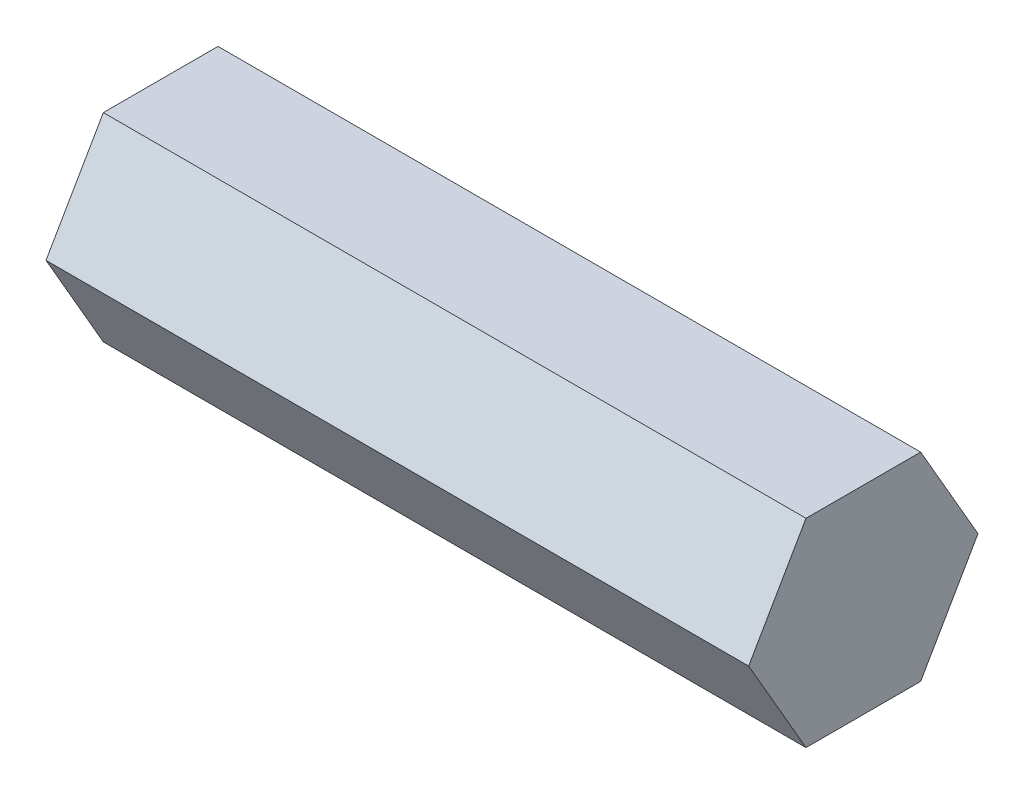
ISO-10303-21;
HEADER;
FILE_DESCRIPTION(('STEP AP214'),'2;1');
FILE_NAME('part.step','',(''),(''),'','','');
FILE_SCHEMA(('AUTOMOTIVE_DESIGN { 1 0 10303 214 1 1 1 1 }'));
ENDSEC;
DATA;
#1=APPLICATION_CONTEXT('core data for automotive mechanical design processes');
#2=APPLICATION_PROTOCOL_DEFINITION('international standard','automotive_design',2000,#1);
#3=PRODUCT_CONTEXT('',#1,'mechanical');
#4=PRODUCT('Part','Part','',(#3));
#5=PRODUCT_RELATED_PRODUCT_CATEGORY('part','',(#4));
#6=PRODUCT_DEFINITION_FORMATION('','',#4);
#7=PRODUCT_DEFINITION_CONTEXT('part definition',#1,'design');
#8=PRODUCT_DEFINITION('design','',#6,#7);
#9=PRODUCT_DEFINITION_SHAPE('','',#8);
#10=(LENGTH_UNIT() NAMED_UNIT(*) SI_UNIT(.MILLI.,.METRE.));
#11=(NAMED_UNIT(*) PLANE_ANGLE_UNIT() SI_UNIT($,.RADIAN.));
#12=(NAMED_UNIT(*) SI_UNIT($,.STERADIAN.) SOLID_ANGLE_UNIT());
#13=UNCERTAINTY_MEASURE_WITH_UNIT(LENGTH_MEASURE(1.E-05),#10,'distance_accuracy_value','');
#14=(GEOMETRIC_REPRESENTATION_CONTEXT(3) GLOBAL_UNCERTAINTY_ASSIGNED_CONTEXT((#13)) GLOBAL_UNIT_ASSIGNED_CONTEXT((#10,
#11,#12)) REPRESENTATION_CONTEXT('',''));
#15=CARTESIAN_POINT('',(0.,0.,0.));
#16=DIRECTION('',(0.,0.,1.));
#17=DIRECTION('',(1.,0.,0.));
#18=AXIS2_PLACEMENT_3D('',#15,#16,#17);
#19=CARTESIAN_POINT('',(44.935,-6.34999999999996,-3.6661742093542));
#20=DIRECTION('',(0.,0.499999999999995,0.866025403784442));
#21=DIRECTION('',(0.,-0.866025403784442,0.499999999999995));
#22=AXIS2_PLACEMENT_3D('',#19,#20,#21);
#23=PLANE('',#22);
#24=DIRECTION('',(0.,0.866025403784441,-0.499999999999995));
#25=VECTOR('',#24,1.);
#26=CARTESIAN_POINT('',(0.,-6.34999999999996,-3.6661742093542));
#27=LINE('',#26,#25);
#28=CARTESIAN_POINT('',(0.,-6.34999999999996,-3.6661742093542));
#29=VERTEX_POINT('',#28);
#30=CARTESIAN_POINT('',(0.,0.,-7.33234841870825));
#31=VERTEX_POINT('',#30);
#32=EDGE_CURVE('E125',#29,#31,#27,.T.);
#33=ORIENTED_EDGE('',*,*,#32,.T.);
#34=DIRECTION('',(-1.,0.,0.));
#35=VECTOR('',#34,1.);
#36=CARTESIAN_POINT('',(44.935,0.,-7.33234841870825));
#37=LINE('',#36,#35);
#38=CARTESIAN_POINT('',(44.935,0.,-7.33234841870825));
#39=VERTEX_POINT('',#38);
#40=EDGE_CURVE('E11',#39,#31,#37,.T.);
#41=ORIENTED_EDGE('',*,*,#40,.F.);
#42=DIRECTION('',(0.,0.866025403784441,-0.499999999999995));
#43=VECTOR('',#42,1.);
#44=CARTESIAN_POINT('',(44.935,-6.34999999999996,-3.6661742093542));
#45=LINE('',#44,#43);
#46=CARTESIAN_POINT('',(44.935,-6.34999999999996,-3.6661742093542));
#47=VERTEX_POINT('',#46);
#48=EDGE_CURVE('E135',#47,#39,#45,.T.);
#49=ORIENTED_EDGE('',*,*,#48,.F.);
#50=DIRECTION('',(-1.,0.,0.));
#51=VECTOR('',#50,1.);
#52=CARTESIAN_POINT('',(44.935,-6.34999999999996,-3.6661742093542));
#53=LINE('',#52,#51);
#54=EDGE_CURVE('E121',#47,#29,#53,.T.);
#55=ORIENTED_EDGE('',*,*,#54,.T.);
#56=EDGE_LOOP('',(#33,#41,#49,#55));
#57=FACE_BOUND('',#56,.T.);
#58=ADVANCED_FACE('F41',(#57),#23,.F.);
#59=CARTESIAN_POINT('',(44.935,0.,-7.33234841870825));
#60=DIRECTION('',(0.,-0.500000000000001,0.866025403784438));
#61=DIRECTION('',(0.,-0.866025403784438,-0.500000000000001));
#62=AXIS2_PLACEMENT_3D('',#59,#60,#61);
#63=PLANE('',#62);
#64=DIRECTION('',(0.,0.866025403784438,0.500000000000001));
#65=VECTOR('',#64,1.);
#66=CARTESIAN_POINT('',(0.,0.,-7.33234841870825));
#67=LINE('',#66,#65);
#68=CARTESIAN_POINT('',(0.,6.35000000000001,-3.66617420935411));
#69=VERTEX_POINT('',#68);
#70=EDGE_CURVE('E128',#31,#69,#67,.T.);
#71=ORIENTED_EDGE('',*,*,#70,.T.);
#72=DIRECTION('',(-1.,0.,0.));
#73=VECTOR('',#72,1.);
#74=CARTESIAN_POINT('',(44.935,6.35000000000001,-3.66617420935411));
#75=LINE('',#74,#73);
#76=CARTESIAN_POINT('',(44.935,6.35000000000001,-3.66617420935411));
#77=VERTEX_POINT('',#76);
#78=EDGE_CURVE('E49',#77,#69,#75,.T.);
#79=ORIENTED_EDGE('',*,*,#78,.F.);
#80=DIRECTION('',(0.,0.866025403784438,0.500000000000001));
#81=VECTOR('',#80,1.);
#82=CARTESIAN_POINT('',(44.935,0.,-7.33234841870825));
#83=LINE('',#82,#81);
#84=EDGE_CURVE('E94',#39,#77,#83,.T.);
#85=ORIENTED_EDGE('',*,*,#84,.F.);
#86=ORIENTED_EDGE('',*,*,#40,.T.);
#87=EDGE_LOOP('',(#71,#79,#85,#86));
#88=FACE_BOUND('',#87,.T.);
#89=ADVANCED_FACE('F159',(#88),#63,.F.);
#90=CARTESIAN_POINT('',(44.935,6.35000000000001,-3.66617420935411));
#91=DIRECTION('',(0.,-1.,0.));
#92=DIRECTION('',(0.,0.,-1.));
#93=AXIS2_PLACEMENT_3D('',#90,#91,#92);
#94=PLANE('',#93);
#95=DIRECTION('',(0.,0.,1.));
#96=VECTOR('',#95,1.);
#97=CARTESIAN_POINT('',(0.,6.35000000000001,-3.66617420935411));
#98=LINE('',#97,#96);
#99=CARTESIAN_POINT('',(0.,6.34999999999999,3.66617420935416));
#100=VERTEX_POINT('',#99);
#101=EDGE_CURVE('E130',#69,#100,#98,.T.);
#102=ORIENTED_EDGE('',*,*,#101,.T.);
#103=DIRECTION('',(-1.,0.,0.));
#104=VECTOR('',#103,1.);
#105=CARTESIAN_POINT('',(44.935,6.34999999999999,3.66617420935416));
#106=LINE('',#105,#104);
#107=CARTESIAN_POINT('',(44.935,6.34999999999999,3.66617420935416));
#108=VERTEX_POINT('',#107);
#109=EDGE_CURVE('E116',#108,#100,#106,.T.);
#110=ORIENTED_EDGE('',*,*,#109,.F.);
#111=DIRECTION('',(0.,0.,1.));
#112=VECTOR('',#111,1.);
#113=CARTESIAN_POINT('',(44.935,6.35000000000001,-3.66617420935411));
#114=LINE('',#113,#112);
#115=EDGE_CURVE('E107',#77,#108,#114,.T.);
#116=ORIENTED_EDGE('',*,*,#115,.F.);
#117=ORIENTED_EDGE('',*,*,#78,.T.);
#118=EDGE_LOOP('',(#102,#110,#116,#117));
#119=FACE_BOUND('',#118,.T.);
#120=ADVANCED_FACE('F141',(#119),#94,.F.);
#121=CARTESIAN_POINT('',(44.935,6.34999999999999,3.66617420935416));
#122=DIRECTION('',(0.,-0.499999999999995,-0.866025403784442));
#123=DIRECTION('',(0.,0.866025403784442,-0.499999999999995));
#124=AXIS2_PLACEMENT_3D('',#121,#122,#123);
#125=PLANE('',#124);
#126=DIRECTION('',(0.,-0.866025403784442,0.499999999999995));
#127=VECTOR('',#126,1.);
#128=CARTESIAN_POINT('',(0.,6.34999999999999,3.66617420935416));
#129=LINE('',#128,#127);
#130=CARTESIAN_POINT('',(0.,0.,7.33234841870825));
#131=VERTEX_POINT('',#130);
#132=EDGE_CURVE('E115',#100,#131,#129,.T.);
#133=ORIENTED_EDGE('',*,*,#132,.T.);
#134=DIRECTION('',(-1.,0.,0.));
#135=VECTOR('',#134,1.);
#136=CARTESIAN_POINT('',(44.935,0.,7.33234841870825));
#137=LINE('',#136,#135);
#138=CARTESIAN_POINT('',(44.935,0.,7.33234841870825));
#139=VERTEX_POINT('',#138);
#140=EDGE_CURVE('E112',#139,#131,#137,.T.);
#141=ORIENTED_EDGE('',*,*,#140,.F.);
#142=DIRECTION('',(0.,-0.866025403784442,0.499999999999995));
#143=VECTOR('',#142,1.);
#144=CARTESIAN_POINT('',(44.935,6.34999999999999,3.66617420935416));
#145=LINE('',#144,#143);
#146=EDGE_CURVE('E101',#108,#139,#145,.T.);
#147=ORIENTED_EDGE('',*,*,#146,.F.);
#148=ORIENTED_EDGE('',*,*,#109,.T.);
#149=EDGE_LOOP('',(#133,#141,#147,#148));
#150=FACE_BOUND('',#149,.T.);
#151=ADVANCED_FACE('F113',(#150),#125,.F.);
#152=CARTESIAN_POINT('',(44.935,0.,7.33234841870825));
#153=DIRECTION('',(0.,0.500000000000007,-0.866025403784435));
#154=DIRECTION('',(0.,0.866025403784435,0.500000000000007));
#155=AXIS2_PLACEMENT_3D('',#152,#153,#154);
#156=PLANE('',#155);
#157=DIRECTION('',(0.,-0.866025403784435,-0.500000000000007));
#158=VECTOR('',#157,1.);
#159=CARTESIAN_POINT('',(0.,0.,7.33234841870825));
#160=LINE('',#159,#158);
#161=CARTESIAN_POINT('',(0.,-6.35000000000004,3.66617420935407));
#162=VERTEX_POINT('',#161);
#163=EDGE_CURVE('E80',#131,#162,#160,.T.);
#164=ORIENTED_EDGE('',*,*,#163,.T.);
#165=DIRECTION('',(-1.,0.,0.));
#166=VECTOR('',#165,1.);
#167=CARTESIAN_POINT('',(44.935,-6.35000000000004,3.66617420935407));
#168=LINE('',#167,#166);
#169=CARTESIAN_POINT('',(44.935,-6.35000000000004,3.66617420935407));
#170=VERTEX_POINT('',#169);
#171=EDGE_CURVE('E117',#170,#162,#168,.T.);
#172=ORIENTED_EDGE('',*,*,#171,.F.);
#173=DIRECTION('',(0.,-0.866025403784435,-0.500000000000007));
#174=VECTOR('',#173,1.);
#175=CARTESIAN_POINT('',(44.935,0.,7.33234841870825));
#176=LINE('',#175,#174);
#177=EDGE_CURVE('E105',#139,#170,#176,.T.);
#178=ORIENTED_EDGE('',*,*,#177,.F.);
#179=ORIENTED_EDGE('',*,*,#140,.T.);
#180=EDGE_LOOP('',(#164,#172,#178,#179));
#181=FACE_BOUND('',#180,.T.);
#182=ADVANCED_FACE('F119',(#181),#156,.F.);
#183=CARTESIAN_POINT('',(44.935,-6.35000000000004,3.66617420935407));
#184=DIRECTION('',(0.,1.,0.));
#185=DIRECTION('',(0.,0.,1.));
#186=AXIS2_PLACEMENT_3D('',#183,#184,#185);
#187=PLANE('',#186);
#188=DIRECTION('',(0.,0.,-1.));
#189=VECTOR('',#188,1.);
#190=CARTESIAN_POINT('',(0.,-6.35000000000004,3.66617420935407));
#191=LINE('',#190,#189);
#192=EDGE_CURVE('E86',#162,#29,#191,.T.);
#193=ORIENTED_EDGE('',*,*,#192,.T.);
#194=ORIENTED_EDGE('',*,*,#54,.F.);
#195=DIRECTION('',(0.,0.,-1.));
#196=VECTOR('',#195,1.);
#197=CARTESIAN_POINT('',(44.935,-6.35000000000004,3.66617420935407));
#198=LINE('',#197,#196);
#199=EDGE_CURVE('E57',#170,#47,#198,.T.);
#200=ORIENTED_EDGE('',*,*,#199,.F.);
#201=ORIENTED_EDGE('',*,*,#171,.T.);
#202=EDGE_LOOP('',(#193,#194,#200,#201));
#203=FACE_BOUND('',#202,.T.);
#204=ADVANCED_FACE('F148',(#203),#187,.F.);
#205=CARTESIAN_POINT('',(44.935,0.,0.));
#206=DIRECTION('',(1.,0.,0.));
#207=DIRECTION('',(0.,0.,-1.));
#208=AXIS2_PLACEMENT_3D('',#205,#206,#207);
#209=PLANE('',#208);
#210=ORIENTED_EDGE('',*,*,#48,.T.);
#211=ORIENTED_EDGE('',*,*,#84,.T.);
#212=ORIENTED_EDGE('',*,*,#115,.T.);
#213=ORIENTED_EDGE('',*,*,#146,.T.);
#214=ORIENTED_EDGE('',*,*,#177,.T.);
#215=ORIENTED_EDGE('',*,*,#199,.T.);
#216=EDGE_LOOP('',(#210,#211,#212,#213,#214,#215));
#217=FACE_BOUND('',#216,.T.);
#218=ADVANCED_FACE('F103',(#217),#209,.T.);
#219=CARTESIAN_POINT('',(0.,0.,0.));
#220=DIRECTION('',(1.,0.,0.));
#221=DIRECTION('',(0.,0.,-1.));
#222=AXIS2_PLACEMENT_3D('',#219,#220,#221);
#223=PLANE('',#222);
#224=ORIENTED_EDGE('',*,*,#32,.F.);
#225=ORIENTED_EDGE('',*,*,#192,.F.);
#226=ORIENTED_EDGE('',*,*,#163,.F.);
#227=ORIENTED_EDGE('',*,*,#132,.F.);
#228=ORIENTED_EDGE('',*,*,#101,.F.);
#229=ORIENTED_EDGE('',*,*,#70,.F.);
#230=EDGE_LOOP('',(#224,#225,#226,#227,#228,#229));
#231=FACE_BOUND('',#230,.T.);
#232=ADVANCED_FACE('F144',(#231),#223,.F.);
#233=CLOSED_SHELL('',(#58,#89,#120,#151,#182,#204,#218,#232));
#234=MANIFOLD_SOLID_BREP('B2',#233);
#235=ADVANCED_BREP_SHAPE_REPRESENTATION('',(#18,#234),#14);
#236=SHAPE_DEFINITION_REPRESENTATION(#9,#235);
ENDSEC;
END-ISO-10303-21;
